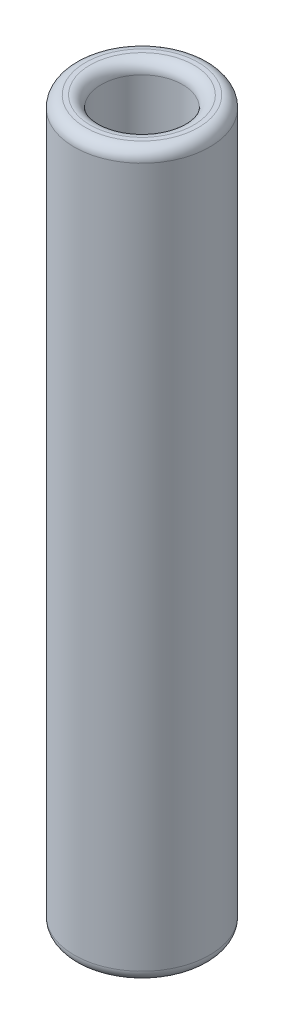
ISO-10303-21;
HEADER;
FILE_DESCRIPTION(('STEP AP214'),'2;1');
FILE_NAME('part.step','',(''),(''),'','','');
FILE_SCHEMA(('AUTOMOTIVE_DESIGN { 1 0 10303 214 1 1 1 1 }'));
ENDSEC;
DATA;
#1=APPLICATION_CONTEXT('core data for automotive mechanical design processes');
#2=APPLICATION_PROTOCOL_DEFINITION('international standard','automotive_design',2000,#1);
#3=PRODUCT_CONTEXT('',#1,'mechanical');
#4=PRODUCT('Part','Part','',(#3));
#5=PRODUCT_RELATED_PRODUCT_CATEGORY('part','',(#4));
#6=PRODUCT_DEFINITION_FORMATION('','',#4);
#7=PRODUCT_DEFINITION_CONTEXT('part definition',#1,'design');
#8=PRODUCT_DEFINITION('design','',#6,#7);
#9=PRODUCT_DEFINITION_SHAPE('','',#8);
#10=(LENGTH_UNIT() NAMED_UNIT(*) SI_UNIT(.MILLI.,.METRE.));
#11=(NAMED_UNIT(*) PLANE_ANGLE_UNIT() SI_UNIT($,.RADIAN.));
#12=(NAMED_UNIT(*) SI_UNIT($,.STERADIAN.) SOLID_ANGLE_UNIT());
#13=UNCERTAINTY_MEASURE_WITH_UNIT(LENGTH_MEASURE(1.E-05),#10,'distance_accuracy_value','');
#14=(GEOMETRIC_REPRESENTATION_CONTEXT(3) GLOBAL_UNCERTAINTY_ASSIGNED_CONTEXT((#13)) GLOBAL_UNIT_ASSIGNED_CONTEXT((#10,
#11,#12)) REPRESENTATION_CONTEXT('',''));
#15=CARTESIAN_POINT('',(0.,0.,0.));
#16=DIRECTION('',(0.,0.,1.));
#17=DIRECTION('',(1.,0.,0.));
#18=AXIS2_PLACEMENT_3D('',#15,#16,#17);
#19=CARTESIAN_POINT('',(0.,40.64,0.));
#20=DIRECTION('',(0.,1.,0.));
#21=DIRECTION('',(0.,0.,1.));
#22=AXIS2_PLACEMENT_3D('',#19,#20,#21);
#23=PLANE('',#22);
#24=CARTESIAN_POINT('',(0.,40.64,0.));
#25=DIRECTION('',(0.,1.,0.));
#26=DIRECTION('',(0.,0.,1.));
#27=AXIS2_PLACEMENT_3D('',#24,#25,#26);
#28=CIRCLE('',#27,2.921);
#29=CARTESIAN_POINT('',(0.,40.64,2.921));
#30=VERTEX_POINT('',#29);
#31=EDGE_CURVE('E10',#30,#30,#28,.F.);
#32=ORIENTED_EDGE('',*,*,#31,.T.);
#33=EDGE_LOOP('',(#32));
#34=FACE_BOUND('',#33,.T.);
#35=CARTESIAN_POINT('',(0.,40.64,0.));
#36=DIRECTION('',(0.,1.,0.));
#37=DIRECTION('',(0.,0.,1.));
#38=AXIS2_PLACEMENT_3D('',#35,#36,#37);
#39=CIRCLE('',#38,3.175);
#40=CARTESIAN_POINT('',(0.,40.64,3.175));
#41=VERTEX_POINT('',#40);
#42=EDGE_CURVE('E42',#41,#41,#39,.T.);
#43=ORIENTED_EDGE('',*,*,#42,.T.);
#44=EDGE_LOOP('',(#43));
#45=FACE_BOUND('',#44,.T.);
#46=ADVANCED_FACE('F35',(#34,#45),#23,.T.);
#47=CARTESIAN_POINT('',(0.,0.,0.));
#48=DIRECTION('',(0.,1.,0.));
#49=DIRECTION('',(0.,0.,1.));
#50=AXIS2_PLACEMENT_3D('',#47,#48,#49);
#51=PLANE('',#50);
#52=CARTESIAN_POINT('',(0.,0.,0.));
#53=DIRECTION('',(0.,1.,0.));
#54=DIRECTION('',(0.,0.,1.));
#55=AXIS2_PLACEMENT_3D('',#52,#53,#54);
#56=CIRCLE('',#55,2.921);
#57=CARTESIAN_POINT('',(0.,0.,2.921));
#58=VERTEX_POINT('',#57);
#59=EDGE_CURVE('E61',#58,#58,#56,.T.);
#60=ORIENTED_EDGE('',*,*,#59,.T.);
#61=EDGE_LOOP('',(#60));
#62=FACE_BOUND('',#61,.T.);
#63=CARTESIAN_POINT('',(0.,0.,0.));
#64=DIRECTION('',(0.,1.,0.));
#65=DIRECTION('',(0.,0.,1.));
#66=AXIS2_PLACEMENT_3D('',#63,#64,#65);
#67=CIRCLE('',#66,3.175);
#68=CARTESIAN_POINT('',(0.,0.,3.175));
#69=VERTEX_POINT('',#68);
#70=EDGE_CURVE('E64',#69,#69,#67,.F.);
#71=ORIENTED_EDGE('',*,*,#70,.T.);
#72=EDGE_LOOP('',(#71));
#73=FACE_BOUND('',#72,.T.);
#74=ADVANCED_FACE('F68',(#62,#73),#51,.F.);
#75=CARTESIAN_POINT('',(0.,40.64,0.));
#76=DIRECTION('',(0.,-1.,0.));
#77=DIRECTION('',(0.,0.,-1.));
#78=AXIS2_PLACEMENT_3D('',#75,#76,#77);
#79=CYLINDRICAL_SURFACE('',#78,3.81);
#80=CARTESIAN_POINT('',(0.,0.634999999999997,0.));
#81=DIRECTION('',(0.,1.,0.));
#82=DIRECTION('',(0.,0.,1.));
#83=AXIS2_PLACEMENT_3D('',#80,#81,#82);
#84=CIRCLE('',#83,3.81);
#85=CARTESIAN_POINT('',(0.,0.634999999999997,3.81));
#86=VERTEX_POINT('',#85);
#87=EDGE_CURVE('E46',#86,#86,#84,.T.);
#88=ORIENTED_EDGE('',*,*,#87,.T.);
#89=EDGE_LOOP('',(#88));
#90=FACE_BOUND('',#89,.T.);
#91=CARTESIAN_POINT('',(0.,40.005,0.));
#92=DIRECTION('',(0.,1.,0.));
#93=DIRECTION('',(0.,0.,1.));
#94=AXIS2_PLACEMENT_3D('',#91,#92,#93);
#95=CIRCLE('',#94,3.81);
#96=CARTESIAN_POINT('',(0.,40.005,3.81));
#97=VERTEX_POINT('',#96);
#98=EDGE_CURVE('E50',#97,#97,#95,.F.);
#99=ORIENTED_EDGE('',*,*,#98,.T.);
#100=EDGE_LOOP('',(#99));
#101=FACE_BOUND('',#100,.T.);
#102=ADVANCED_FACE('F78',(#90,#101),#79,.T.);
#103=CARTESIAN_POINT('',(0.,40.64,0.));
#104=DIRECTION('',(0.,-1.,0.));
#105=DIRECTION('',(0.,0.,-1.));
#106=AXIS2_PLACEMENT_3D('',#103,#104,#105);
#107=CYLINDRICAL_SURFACE('',#106,2.286);
#108=CARTESIAN_POINT('',(0.,0.634999999999997,0.));
#109=DIRECTION('',(0.,1.,0.));
#110=DIRECTION('',(0.,0.,1.));
#111=AXIS2_PLACEMENT_3D('',#108,#109,#110);
#112=CIRCLE('',#111,2.286);
#113=CARTESIAN_POINT('',(0.,0.634999999999997,2.286));
#114=VERTEX_POINT('',#113);
#115=EDGE_CURVE('E55',#114,#114,#112,.F.);
#116=ORIENTED_EDGE('',*,*,#115,.T.);
#117=EDGE_LOOP('',(#116));
#118=FACE_BOUND('',#117,.T.);
#119=CARTESIAN_POINT('',(0.,40.005,0.));
#120=DIRECTION('',(0.,1.,0.));
#121=DIRECTION('',(0.,0.,1.));
#122=AXIS2_PLACEMENT_3D('',#119,#120,#121);
#123=CIRCLE('',#122,2.286);
#124=CARTESIAN_POINT('',(0.,40.005,2.286));
#125=VERTEX_POINT('',#124);
#126=EDGE_CURVE('E58',#125,#125,#123,.T.);
#127=ORIENTED_EDGE('',*,*,#126,.T.);
#128=EDGE_LOOP('',(#127));
#129=FACE_BOUND('',#128,.T.);
#130=ADVANCED_FACE('F81',(#118,#129),#107,.F.);
#131=CARTESIAN_POINT('',(0.,0.634999999999997,0.));
#132=DIRECTION('',(0.,1.,0.));
#133=DIRECTION('',(0.,0.,1.));
#134=AXIS2_PLACEMENT_3D('',#131,#132,#133);
#135=TOROIDAL_SURFACE('',#134,2.921,0.635);
#136=ORIENTED_EDGE('',*,*,#115,.F.);
#137=EDGE_LOOP('',(#136));
#138=FACE_BOUND('',#137,.T.);
#139=ORIENTED_EDGE('',*,*,#59,.F.);
#140=EDGE_LOOP('',(#139));
#141=FACE_BOUND('',#140,.T.);
#142=ADVANCED_FACE('F74',(#138,#141),#135,.T.);
#143=CARTESIAN_POINT('',(0.,0.634999999999997,0.));
#144=DIRECTION('',(0.,1.,0.));
#145=DIRECTION('',(0.,0.,1.));
#146=AXIS2_PLACEMENT_3D('',#143,#144,#145);
#147=TOROIDAL_SURFACE('',#146,3.175,0.635);
#148=ORIENTED_EDGE('',*,*,#70,.F.);
#149=EDGE_LOOP('',(#148));
#150=FACE_BOUND('',#149,.T.);
#151=ORIENTED_EDGE('',*,*,#87,.F.);
#152=EDGE_LOOP('',(#151));
#153=FACE_BOUND('',#152,.T.);
#154=ADVANCED_FACE('F70',(#150,#153),#147,.T.);
#155=CARTESIAN_POINT('',(0.,40.005,0.));
#156=DIRECTION('',(0.,1.,0.));
#157=DIRECTION('',(0.,0.,1.));
#158=AXIS2_PLACEMENT_3D('',#155,#156,#157);
#159=TOROIDAL_SURFACE('',#158,2.921,0.635);
#160=ORIENTED_EDGE('',*,*,#31,.F.);
#161=EDGE_LOOP('',(#160));
#162=FACE_BOUND('',#161,.T.);
#163=ORIENTED_EDGE('',*,*,#126,.F.);
#164=EDGE_LOOP('',(#163));
#165=FACE_BOUND('',#164,.T.);
#166=ADVANCED_FACE('F73',(#162,#165),#159,.T.);
#167=CARTESIAN_POINT('',(0.,40.005,0.));
#168=DIRECTION('',(0.,1.,0.));
#169=DIRECTION('',(0.,0.,1.));
#170=AXIS2_PLACEMENT_3D('',#167,#168,#169);
#171=TOROIDAL_SURFACE('',#170,3.175,0.635);
#172=ORIENTED_EDGE('',*,*,#98,.F.);
#173=EDGE_LOOP('',(#172));
#174=FACE_BOUND('',#173,.T.);
#175=ORIENTED_EDGE('',*,*,#42,.F.);
#176=EDGE_LOOP('',(#175));
#177=FACE_BOUND('',#176,.T.);
#178=ADVANCED_FACE('F37',(#174,#177),#171,.T.);
#179=CLOSED_SHELL('',(#46,#74,#102,#130,#142,#154,#166,#178));
#180=MANIFOLD_SOLID_BREP('B2',#179);
#181=ADVANCED_BREP_SHAPE_REPRESENTATION('',(#18,#180),#14);
#182=SHAPE_DEFINITION_REPRESENTATION(#9,#181);
ENDSEC;
END-ISO-10303-21;
